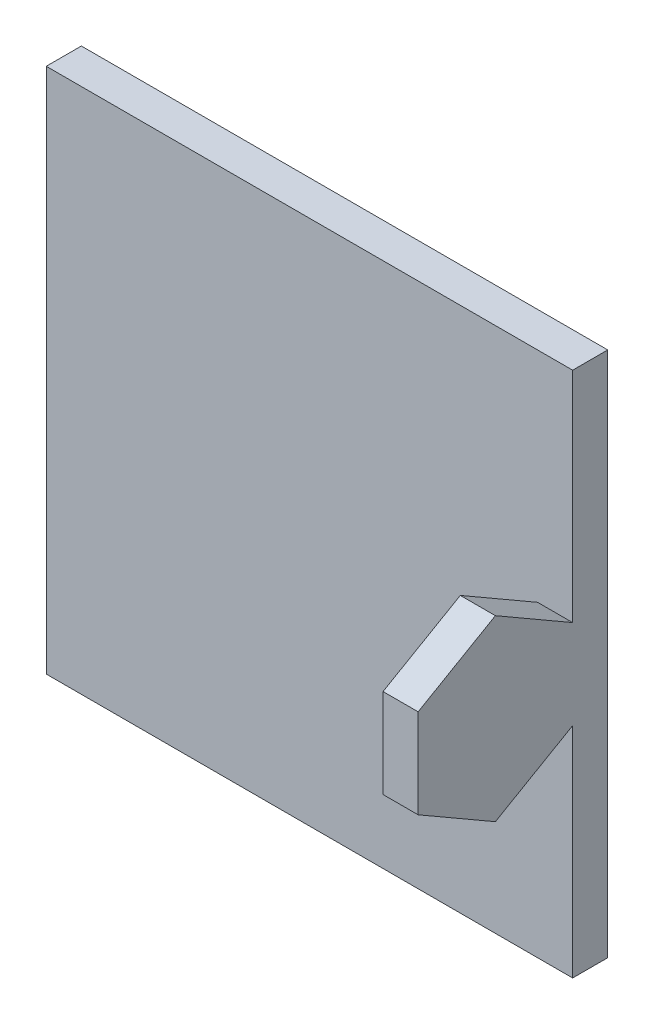
ISO-10303-21;
HEADER;
FILE_DESCRIPTION(('STEP AP214'),'2;1');
FILE_NAME('part.step','',(''),(''),'','','');
FILE_SCHEMA(('AUTOMOTIVE_DESIGN { 1 0 10303 214 1 1 1 1 }'));
ENDSEC;
DATA;
#1=APPLICATION_CONTEXT('core data for automotive mechanical design processes');
#2=APPLICATION_PROTOCOL_DEFINITION('international standard','automotive_design',2000,#1);
#3=PRODUCT_CONTEXT('',#1,'mechanical');
#4=PRODUCT('Part','Part','',(#3));
#5=PRODUCT_RELATED_PRODUCT_CATEGORY('part','',(#4));
#6=PRODUCT_DEFINITION_FORMATION('','',#4);
#7=PRODUCT_DEFINITION_CONTEXT('part definition',#1,'design');
#8=PRODUCT_DEFINITION('design','',#6,#7);
#9=PRODUCT_DEFINITION_SHAPE('','',#8);
#10=(LENGTH_UNIT() NAMED_UNIT(*) SI_UNIT(.MILLI.,.METRE.));
#11=(NAMED_UNIT(*) PLANE_ANGLE_UNIT() SI_UNIT($,.RADIAN.));
#12=(NAMED_UNIT(*) SI_UNIT($,.STERADIAN.) SOLID_ANGLE_UNIT());
#13=UNCERTAINTY_MEASURE_WITH_UNIT(LENGTH_MEASURE(1.E-05),#10,'distance_accuracy_value','');
#14=(GEOMETRIC_REPRESENTATION_CONTEXT(3) GLOBAL_UNCERTAINTY_ASSIGNED_CONTEXT((#13)) GLOBAL_UNIT_ASSIGNED_CONTEXT((#10,
#11,#12)) REPRESENTATION_CONTEXT('',''));
#15=CARTESIAN_POINT('',(0.,0.,0.));
#16=DIRECTION('',(0.,0.,1.));
#17=DIRECTION('',(1.,0.,0.));
#18=AXIS2_PLACEMENT_3D('',#15,#16,#17);
#19=CARTESIAN_POINT('',(0.,0.,6.35));
#20=DIRECTION('',(0.,0.,-1.));
#21=DIRECTION('',(-1.,0.,0.));
#22=AXIS2_PLACEMENT_3D('',#19,#20,#21);
#23=PLANE('',#22);
#24=DIRECTION('',(1.,0.,0.));
#25=VECTOR('',#24,1.);
#26=CARTESIAN_POINT('',(-6.35,39.5536551279896,6.34999999999999));
#27=LINE('',#26,#25);
#28=CARTESIAN_POINT('',(-6.35,39.5536551279896,6.34999999999999));
#29=VERTEX_POINT('',#28);
#30=CARTESIAN_POINT('',(0.,39.5536551279896,6.34999999999999));
#31=VERTEX_POINT('',#30);
#32=EDGE_CURVE('E136',#29,#31,#27,.T.);
#33=ORIENTED_EDGE('',*,*,#32,.F.);
#34=DIRECTION('',(0.,1.,0.));
#35=VECTOR('',#34,1.);
#36=CARTESIAN_POINT('',(-6.35,55.6963448720104,6.35));
#37=LINE('',#36,#35);
#38=CARTESIAN_POINT('',(-6.35,55.6963448720104,6.35));
#39=VERTEX_POINT('',#38);
#40=EDGE_CURVE('E128',#29,#39,#37,.T.);
#41=ORIENTED_EDGE('',*,*,#40,.T.);
#42=DIRECTION('',(1.,0.,0.));
#43=VECTOR('',#42,1.);
#44=CARTESIAN_POINT('',(-6.35,55.6963448720104,6.35));
#45=LINE('',#44,#43);
#46=CARTESIAN_POINT('',(0.,55.6963448720104,6.35));
#47=VERTEX_POINT('',#46);
#48=EDGE_CURVE('E115',#39,#47,#45,.T.);
#49=ORIENTED_EDGE('',*,*,#48,.T.);
#50=DIRECTION('',(0.,-1.,0.));
#51=VECTOR('',#50,1.);
#52=CARTESIAN_POINT('',(0.,95.25,6.35));
#53=LINE('',#52,#51);
#54=CARTESIAN_POINT('',(0.,95.25,6.35));
#55=VERTEX_POINT('',#54);
#56=EDGE_CURVE('E173',#55,#47,#53,.T.);
#57=ORIENTED_EDGE('',*,*,#56,.F.);
#58=DIRECTION('',(1.,0.,0.));
#59=VECTOR('',#58,1.);
#60=CARTESIAN_POINT('',(-95.25,95.25,6.35));
#61=LINE('',#60,#59);
#62=CARTESIAN_POINT('',(-95.25,95.25,6.35));
#63=VERTEX_POINT('',#62);
#64=EDGE_CURVE('E169',#63,#55,#61,.T.);
#65=ORIENTED_EDGE('',*,*,#64,.F.);
#66=DIRECTION('',(0.,-1.,0.));
#67=VECTOR('',#66,1.);
#68=CARTESIAN_POINT('',(-95.25,95.25,6.35));
#69=LINE('',#68,#67);
#70=CARTESIAN_POINT('',(-95.25,0.,6.35));
#71=VERTEX_POINT('',#70);
#72=EDGE_CURVE('E178',#63,#71,#69,.T.);
#73=ORIENTED_EDGE('',*,*,#72,.T.);
#74=DIRECTION('',(1.,0.,0.));
#75=VECTOR('',#74,1.);
#76=CARTESIAN_POINT('',(-95.25,0.,6.35));
#77=LINE('',#76,#75);
#78=CARTESIAN_POINT('',(0.,0.,6.35));
#79=VERTEX_POINT('',#78);
#80=EDGE_CURVE('E175',#71,#79,#77,.T.);
#81=ORIENTED_EDGE('',*,*,#80,.T.);
#82=EDGE_CURVE('E171',#31,#79,#53,.T.);
#83=ORIENTED_EDGE('',*,*,#82,.F.);
#84=EDGE_LOOP('',(#33,#41,#49,#57,#65,#73,#81,#83));
#85=FACE_BOUND('',#84,.T.);
#86=ADVANCED_FACE('F33',(#85),#23,.F.);
#87=CARTESIAN_POINT('',(-95.25,95.25,6.35));
#88=DIRECTION('',(0.,1.,0.));
#89=DIRECTION('',(0.,0.,1.));
#90=AXIS2_PLACEMENT_3D('',#87,#88,#89);
#91=PLANE('',#90);
#92=DIRECTION('',(1.,0.,0.));
#93=VECTOR('',#92,1.);
#94=CARTESIAN_POINT('',(-95.25,95.25,0.));
#95=LINE('',#94,#93);
#96=CARTESIAN_POINT('',(-95.25,95.25,0.));
#97=VERTEX_POINT('',#96);
#98=CARTESIAN_POINT('',(0.,95.25,0.));
#99=VERTEX_POINT('',#98);
#100=EDGE_CURVE('E161',#97,#99,#95,.T.);
#101=ORIENTED_EDGE('',*,*,#100,.F.);
#102=DIRECTION('',(0.,0.,-1.));
#103=VECTOR('',#102,1.);
#104=CARTESIAN_POINT('',(-95.25,95.25,6.35));
#105=LINE('',#104,#103);
#106=EDGE_CURVE('E11',#63,#97,#105,.T.);
#107=ORIENTED_EDGE('',*,*,#106,.F.);
#108=ORIENTED_EDGE('',*,*,#64,.T.);
#109=DIRECTION('',(0.,0.,-1.));
#110=VECTOR('',#109,1.);
#111=CARTESIAN_POINT('',(0.,95.25,6.35));
#112=LINE('',#111,#110);
#113=EDGE_CURVE('E37',#55,#99,#112,.T.);
#114=ORIENTED_EDGE('',*,*,#113,.T.);
#115=EDGE_LOOP('',(#101,#107,#108,#114));
#116=FACE_BOUND('',#115,.T.);
#117=ADVANCED_FACE('F35',(#116),#91,.T.);
#118=CARTESIAN_POINT('',(-95.25,95.25,6.35));
#119=DIRECTION('',(1.,0.,0.));
#120=DIRECTION('',(0.,1.,0.));
#121=AXIS2_PLACEMENT_3D('',#118,#119,#120);
#122=PLANE('',#121);
#123=DIRECTION('',(0.,-1.,0.));
#124=VECTOR('',#123,1.);
#125=CARTESIAN_POINT('',(-95.25,95.25,0.));
#126=LINE('',#125,#124);
#127=CARTESIAN_POINT('',(-95.25,0.,0.));
#128=VERTEX_POINT('',#127);
#129=EDGE_CURVE('E172',#97,#128,#126,.T.);
#130=ORIENTED_EDGE('',*,*,#129,.T.);
#131=DIRECTION('',(0.,0.,-1.));
#132=VECTOR('',#131,1.);
#133=CARTESIAN_POINT('',(-95.25,0.,6.35));
#134=LINE('',#133,#132);
#135=EDGE_CURVE('E42',#71,#128,#134,.T.);
#136=ORIENTED_EDGE('',*,*,#135,.F.);
#137=ORIENTED_EDGE('',*,*,#72,.F.);
#138=ORIENTED_EDGE('',*,*,#106,.T.);
#139=EDGE_LOOP('',(#130,#136,#137,#138));
#140=FACE_BOUND('',#139,.T.);
#141=ADVANCED_FACE('F198',(#140),#122,.F.);
#142=CARTESIAN_POINT('',(-95.25,0.,6.35));
#143=DIRECTION('',(0.,1.,0.));
#144=DIRECTION('',(0.,0.,1.));
#145=AXIS2_PLACEMENT_3D('',#142,#143,#144);
#146=PLANE('',#145);
#147=DIRECTION('',(1.,0.,0.));
#148=VECTOR('',#147,1.);
#149=CARTESIAN_POINT('',(-95.25,0.,0.));
#150=LINE('',#149,#148);
#151=CARTESIAN_POINT('',(0.,0.,0.));
#152=VERTEX_POINT('',#151);
#153=EDGE_CURVE('E185',#128,#152,#150,.T.);
#154=ORIENTED_EDGE('',*,*,#153,.T.);
#155=DIRECTION('',(0.,0.,-1.));
#156=VECTOR('',#155,1.);
#157=CARTESIAN_POINT('',(0.,0.,6.35));
#158=LINE('',#157,#156);
#159=EDGE_CURVE('E190',#79,#152,#158,.T.);
#160=ORIENTED_EDGE('',*,*,#159,.F.);
#161=ORIENTED_EDGE('',*,*,#80,.F.);
#162=ORIENTED_EDGE('',*,*,#135,.T.);
#163=EDGE_LOOP('',(#154,#160,#161,#162));
#164=FACE_BOUND('',#163,.T.);
#165=ADVANCED_FACE('F201',(#164),#146,.F.);
#166=CARTESIAN_POINT('',(0.,95.25,6.35));
#167=DIRECTION('',(1.,0.,0.));
#168=DIRECTION('',(0.,1.,0.));
#169=AXIS2_PLACEMENT_3D('',#166,#167,#168);
#170=PLANE('',#169);
#171=DIRECTION('',(0.,-1.,0.));
#172=VECTOR('',#171,1.);
#173=CARTESIAN_POINT('',(0.,95.25,0.));
#174=LINE('',#173,#172);
#175=EDGE_CURVE('E182',#99,#152,#174,.T.);
#176=ORIENTED_EDGE('',*,*,#175,.F.);
#177=ORIENTED_EDGE('',*,*,#113,.F.);
#178=ORIENTED_EDGE('',*,*,#56,.T.);
#179=DIRECTION('',(0.,0.500000000000004,0.866025403784436));
#180=VECTOR('',#179,1.);
#181=CARTESIAN_POINT('',(0.,55.6963448720104,6.35));
#182=LINE('',#181,#180);
#183=CARTESIAN_POINT('',(0.,63.7676897440209,20.3299794037325));
#184=VERTEX_POINT('',#183);
#185=EDGE_CURVE('E50',#47,#184,#182,.T.);
#186=ORIENTED_EDGE('',*,*,#185,.T.);
#187=DIRECTION('',(0.,-0.499999999999997,0.86602540378444));
#188=VECTOR('',#187,1.);
#189=CARTESIAN_POINT('',(0.,63.7676897440209,20.3299794037325));
#190=LINE('',#189,#188);
#191=CARTESIAN_POINT('',(0.,55.6963448720105,34.3099588074651));
#192=VERTEX_POINT('',#191);
#193=EDGE_CURVE('E152',#184,#192,#190,.T.);
#194=ORIENTED_EDGE('',*,*,#193,.T.);
#195=DIRECTION('',(0.,-1.,0.));
#196=VECTOR('',#195,1.);
#197=CARTESIAN_POINT('',(0.,55.6963448720105,34.3099588074651));
#198=LINE('',#197,#196);
#199=CARTESIAN_POINT('',(0.,39.5536551279897,34.3099588074651));
#200=VERTEX_POINT('',#199);
#201=EDGE_CURVE('E155',#192,#200,#198,.T.);
#202=ORIENTED_EDGE('',*,*,#201,.T.);
#203=DIRECTION('',(0.,-0.500000000000004,-0.866025403784437));
#204=VECTOR('',#203,1.);
#205=CARTESIAN_POINT('',(0.,39.5536551279897,34.3099588074651));
#206=LINE('',#205,#204);
#207=CARTESIAN_POINT('',(0.,31.4823102559792,20.3299794037325));
#208=VERTEX_POINT('',#207);
#209=EDGE_CURVE('E140',#200,#208,#206,.T.);
#210=ORIENTED_EDGE('',*,*,#209,.T.);
#211=DIRECTION('',(0.,0.499999999999998,-0.86602540378444));
#212=VECTOR('',#211,1.);
#213=CARTESIAN_POINT('',(0.,31.4823102559792,20.3299794037325));
#214=LINE('',#213,#212);
#215=EDGE_CURVE('E137',#208,#31,#214,.T.);
#216=ORIENTED_EDGE('',*,*,#215,.T.);
#217=ORIENTED_EDGE('',*,*,#82,.T.);
#218=ORIENTED_EDGE('',*,*,#159,.T.);
#219=EDGE_LOOP('',(#176,#177,#178,#186,#194,#202,#210,#216,#217,#218));
#220=FACE_BOUND('',#219,.T.);
#221=ADVANCED_FACE('F193',(#220),#170,.T.);
#222=CARTESIAN_POINT('',(0.,0.,0.));
#223=DIRECTION('',(0.,0.,-1.));
#224=DIRECTION('',(-1.,0.,0.));
#225=AXIS2_PLACEMENT_3D('',#222,#223,#224);
#226=PLANE('',#225);
#227=ORIENTED_EDGE('',*,*,#100,.T.);
#228=ORIENTED_EDGE('',*,*,#175,.T.);
#229=ORIENTED_EDGE('',*,*,#153,.F.);
#230=ORIENTED_EDGE('',*,*,#129,.F.);
#231=EDGE_LOOP('',(#227,#228,#229,#230));
#232=FACE_BOUND('',#231,.T.);
#233=ADVANCED_FACE('F196',(#232),#226,.T.);
#234=CARTESIAN_POINT('',(-6.35,31.4823102559792,20.3299794037325));
#235=DIRECTION('',(0.,-0.86602540378444,-0.499999999999998));
#236=DIRECTION('',(0.,0.499999999999998,-0.86602540378444));
#237=AXIS2_PLACEMENT_3D('',#234,#235,#236);
#238=PLANE('',#237);
#239=ORIENTED_EDGE('',*,*,#215,.F.);
#240=DIRECTION('',(1.,0.,0.));
#241=VECTOR('',#240,1.);
#242=CARTESIAN_POINT('',(-6.35,31.4823102559792,20.3299794037325));
#243=LINE('',#242,#241);
#244=CARTESIAN_POINT('',(-6.35,31.4823102559792,20.3299794037325));
#245=VERTEX_POINT('',#244);
#246=EDGE_CURVE('E162',#245,#208,#243,.T.);
#247=ORIENTED_EDGE('',*,*,#246,.F.);
#248=DIRECTION('',(0.,0.499999999999998,-0.86602540378444));
#249=VECTOR('',#248,1.);
#250=CARTESIAN_POINT('',(-6.35,31.4823102559792,20.3299794037325));
#251=LINE('',#250,#249);
#252=EDGE_CURVE('E122',#245,#29,#251,.T.);
#253=ORIENTED_EDGE('',*,*,#252,.T.);
#254=ORIENTED_EDGE('',*,*,#32,.T.);
#255=EDGE_LOOP('',(#239,#247,#253,#254));
#256=FACE_BOUND('',#255,.T.);
#257=ADVANCED_FACE('F214',(#256),#238,.T.);
#258=CARTESIAN_POINT('',(-6.35,39.5536551279897,34.3099588074651));
#259=DIRECTION('',(0.,-0.866025403784436,0.500000000000004));
#260=DIRECTION('',(0.,-0.500000000000004,-0.866025403784437));
#261=AXIS2_PLACEMENT_3D('',#258,#259,#260);
#262=PLANE('',#261);
#263=ORIENTED_EDGE('',*,*,#209,.F.);
#264=DIRECTION('',(1.,0.,0.));
#265=VECTOR('',#264,1.);
#266=CARTESIAN_POINT('',(-6.35,39.5536551279897,34.3099588074651));
#267=LINE('',#266,#265);
#268=CARTESIAN_POINT('',(-6.35,39.5536551279897,34.3099588074651));
#269=VERTEX_POINT('',#268);
#270=EDGE_CURVE('E164',#269,#200,#267,.T.);
#271=ORIENTED_EDGE('',*,*,#270,.F.);
#272=DIRECTION('',(0.,-0.500000000000004,-0.866025403784437));
#273=VECTOR('',#272,1.);
#274=CARTESIAN_POINT('',(-6.35,39.5536551279897,34.3099588074651));
#275=LINE('',#274,#273);
#276=EDGE_CURVE('E147',#269,#245,#275,.T.);
#277=ORIENTED_EDGE('',*,*,#276,.T.);
#278=ORIENTED_EDGE('',*,*,#246,.T.);
#279=EDGE_LOOP('',(#263,#271,#277,#278));
#280=FACE_BOUND('',#279,.T.);
#281=ADVANCED_FACE('F211',(#280),#262,.T.);
#282=CARTESIAN_POINT('',(-6.35,55.6963448720105,34.3099588074651));
#283=DIRECTION('',(0.,0.,1.));
#284=DIRECTION('',(1.,0.,0.));
#285=AXIS2_PLACEMENT_3D('',#282,#283,#284);
#286=PLANE('',#285);
#287=ORIENTED_EDGE('',*,*,#201,.F.);
#288=DIRECTION('',(1.,0.,0.));
#289=VECTOR('',#288,1.);
#290=CARTESIAN_POINT('',(-6.35,55.6963448720105,34.3099588074651));
#291=LINE('',#290,#289);
#292=CARTESIAN_POINT('',(-6.35,55.6963448720105,34.3099588074651));
#293=VERTEX_POINT('',#292);
#294=EDGE_CURVE('E166',#293,#192,#291,.T.);
#295=ORIENTED_EDGE('',*,*,#294,.F.);
#296=DIRECTION('',(0.,-1.,0.));
#297=VECTOR('',#296,1.);
#298=CARTESIAN_POINT('',(-6.35,55.6963448720105,34.3099588074651));
#299=LINE('',#298,#297);
#300=EDGE_CURVE('E144',#293,#269,#299,.T.);
#301=ORIENTED_EDGE('',*,*,#300,.T.);
#302=ORIENTED_EDGE('',*,*,#270,.T.);
#303=EDGE_LOOP('',(#287,#295,#301,#302));
#304=FACE_BOUND('',#303,.T.);
#305=ADVANCED_FACE('F207',(#304),#286,.T.);
#306=CARTESIAN_POINT('',(-6.35,63.7676897440209,20.3299794037325));
#307=DIRECTION('',(0.,0.86602540378444,0.499999999999997));
#308=DIRECTION('',(0.,-0.499999999999998,0.86602540378444));
#309=AXIS2_PLACEMENT_3D('',#306,#307,#308);
#310=PLANE('',#309);
#311=ORIENTED_EDGE('',*,*,#193,.F.);
#312=DIRECTION('',(1.,0.,0.));
#313=VECTOR('',#312,1.);
#314=CARTESIAN_POINT('',(-6.35,63.7676897440209,20.3299794037325));
#315=LINE('',#314,#313);
#316=CARTESIAN_POINT('',(-6.35,63.7676897440209,20.3299794037325));
#317=VERTEX_POINT('',#316);
#318=EDGE_CURVE('E121',#317,#184,#315,.T.);
#319=ORIENTED_EDGE('',*,*,#318,.F.);
#320=DIRECTION('',(0.,-0.499999999999997,0.86602540378444));
#321=VECTOR('',#320,1.);
#322=CARTESIAN_POINT('',(-6.35,63.7676897440209,20.3299794037325));
#323=LINE('',#322,#321);
#324=EDGE_CURVE('E132',#317,#293,#323,.T.);
#325=ORIENTED_EDGE('',*,*,#324,.T.);
#326=ORIENTED_EDGE('',*,*,#294,.T.);
#327=EDGE_LOOP('',(#311,#319,#325,#326));
#328=FACE_BOUND('',#327,.T.);
#329=ADVANCED_FACE('F205',(#328),#310,.T.);
#330=CARTESIAN_POINT('',(-6.35,55.6963448720104,6.35));
#331=DIRECTION('',(0.,0.866025403784436,-0.500000000000004));
#332=DIRECTION('',(0.,0.500000000000004,0.866025403784437));
#333=AXIS2_PLACEMENT_3D('',#330,#331,#332);
#334=PLANE('',#333);
#335=ORIENTED_EDGE('',*,*,#185,.F.);
#336=ORIENTED_EDGE('',*,*,#48,.F.);
#337=DIRECTION('',(0.,0.500000000000004,0.866025403784436));
#338=VECTOR('',#337,1.);
#339=CARTESIAN_POINT('',(-6.35,55.6963448720104,6.35));
#340=LINE('',#339,#338);
#341=EDGE_CURVE('E118',#39,#317,#340,.T.);
#342=ORIENTED_EDGE('',*,*,#341,.T.);
#343=ORIENTED_EDGE('',*,*,#318,.T.);
#344=EDGE_LOOP('',(#335,#336,#342,#343));
#345=FACE_BOUND('',#344,.T.);
#346=ADVANCED_FACE('F117',(#345),#334,.T.);
#347=CARTESIAN_POINT('',(-6.35,0.,0.));
#348=DIRECTION('',(1.,0.,0.));
#349=DIRECTION('',(0.,1.,0.));
#350=AXIS2_PLACEMENT_3D('',#347,#348,#349);
#351=PLANE('',#350);
#352=ORIENTED_EDGE('',*,*,#40,.F.);
#353=ORIENTED_EDGE('',*,*,#252,.F.);
#354=ORIENTED_EDGE('',*,*,#276,.F.);
#355=ORIENTED_EDGE('',*,*,#300,.F.);
#356=ORIENTED_EDGE('',*,*,#324,.F.);
#357=ORIENTED_EDGE('',*,*,#341,.F.);
#358=EDGE_LOOP('',(#352,#353,#354,#355,#356,#357));
#359=FACE_BOUND('',#358,.T.);
#360=ADVANCED_FACE('F126',(#359),#351,.F.);
#361=CLOSED_SHELL('',(#86,#117,#141,#165,#221,#233,#257,#281,#305,#329,#346,#360));
#362=MANIFOLD_SOLID_BREP('B2',#361);
#363=ADVANCED_BREP_SHAPE_REPRESENTATION('',(#18,#362),#14);
#364=SHAPE_DEFINITION_REPRESENTATION(#9,#363);
ENDSEC;
END-ISO-10303-21;
